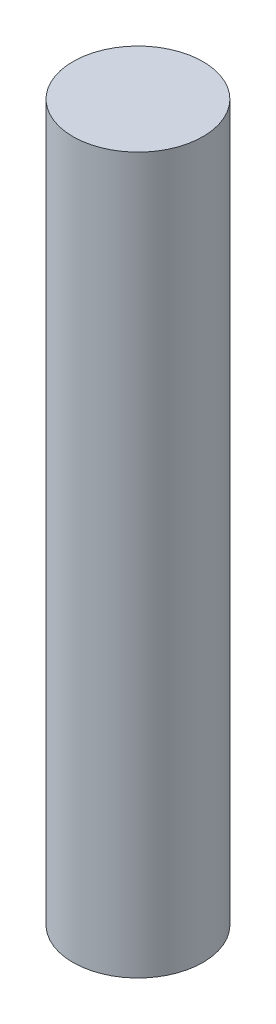
ISO-10303-21;
HEADER;
FILE_DESCRIPTION(('STEP AP214'),'2;1');
FILE_NAME('part.step','',(''),(''),'','','');
FILE_SCHEMA(('AUTOMOTIVE_DESIGN { 1 0 10303 214 1 1 1 1 }'));
ENDSEC;
DATA;
#1=APPLICATION_CONTEXT('core data for automotive mechanical design processes');
#2=APPLICATION_PROTOCOL_DEFINITION('international standard','automotive_design',2000,#1);
#3=PRODUCT_CONTEXT('',#1,'mechanical');
#4=PRODUCT('Part','Part','',(#3));
#5=PRODUCT_RELATED_PRODUCT_CATEGORY('part','',(#4));
#6=PRODUCT_DEFINITION_FORMATION('','',#4);
#7=PRODUCT_DEFINITION_CONTEXT('part definition',#1,'design');
#8=PRODUCT_DEFINITION('design','',#6,#7);
#9=PRODUCT_DEFINITION_SHAPE('','',#8);
#10=(LENGTH_UNIT() NAMED_UNIT(*) SI_UNIT(.MILLI.,.METRE.));
#11=(NAMED_UNIT(*) PLANE_ANGLE_UNIT() SI_UNIT($,.RADIAN.));
#12=(NAMED_UNIT(*) SI_UNIT($,.STERADIAN.) SOLID_ANGLE_UNIT());
#13=UNCERTAINTY_MEASURE_WITH_UNIT(LENGTH_MEASURE(1.E-05),#10,'distance_accuracy_value','');
#14=(GEOMETRIC_REPRESENTATION_CONTEXT(3) GLOBAL_UNCERTAINTY_ASSIGNED_CONTEXT((#13)) GLOBAL_UNIT_ASSIGNED_CONTEXT((#10,
#11,#12)) REPRESENTATION_CONTEXT('',''));
#15=CARTESIAN_POINT('',(0.,0.,0.));
#16=DIRECTION('',(0.,0.,1.));
#17=DIRECTION('',(1.,0.,0.));
#18=AXIS2_PLACEMENT_3D('',#15,#16,#17);
#19=CARTESIAN_POINT('',(0.,22.,0.));
#20=DIRECTION('',(0.,-1.,0.));
#21=DIRECTION('',(0.,0.,-1.));
#22=AXIS2_PLACEMENT_3D('',#19,#20,#21);
#23=CYLINDRICAL_SURFACE('',#22,2.);
#24=CARTESIAN_POINT('',(0.,22.,0.));
#25=DIRECTION('',(0.,1.,0.));
#26=DIRECTION('',(0.,0.,1.));
#27=AXIS2_PLACEMENT_3D('',#24,#25,#26);
#28=CIRCLE('',#27,2.);
#29=CARTESIAN_POINT('',(0.,22.,2.));
#30=VERTEX_POINT('',#29);
#31=EDGE_CURVE('E10',#30,#30,#28,.T.);
#32=ORIENTED_EDGE('',*,*,#31,.F.);
#33=EDGE_LOOP('',(#32));
#34=FACE_BOUND('',#33,.T.);
#35=CARTESIAN_POINT('',(0.,0.,0.));
#36=DIRECTION('',(0.,1.,0.));
#37=DIRECTION('',(0.,0.,1.));
#38=AXIS2_PLACEMENT_3D('',#35,#36,#37);
#39=CIRCLE('',#38,2.);
#40=CARTESIAN_POINT('',(0.,0.,2.));
#41=VERTEX_POINT('',#40);
#42=EDGE_CURVE('E36',#41,#41,#39,.T.);
#43=ORIENTED_EDGE('',*,*,#42,.T.);
#44=EDGE_LOOP('',(#43));
#45=FACE_BOUND('',#44,.T.);
#46=ADVANCED_FACE('F33',(#34,#45),#23,.T.);
#47=CARTESIAN_POINT('',(0.,22.,0.));
#48=DIRECTION('',(0.,1.,0.));
#49=DIRECTION('',(0.,0.,1.));
#50=AXIS2_PLACEMENT_3D('',#47,#48,#49);
#51=PLANE('',#50);
#52=ORIENTED_EDGE('',*,*,#31,.T.);
#53=EDGE_LOOP('',(#52));
#54=FACE_BOUND('',#53,.T.);
#55=ADVANCED_FACE('F48',(#54),#51,.T.);
#56=CARTESIAN_POINT('',(0.,0.,0.));
#57=DIRECTION('',(0.,1.,0.));
#58=DIRECTION('',(0.,0.,1.));
#59=AXIS2_PLACEMENT_3D('',#56,#57,#58);
#60=PLANE('',#59);
#61=ORIENTED_EDGE('',*,*,#42,.F.);
#62=EDGE_LOOP('',(#61));
#63=FACE_BOUND('',#62,.T.);
#64=ADVANCED_FACE('F46',(#63),#60,.F.);
#65=CLOSED_SHELL('',(#46,#55,#64));
#66=MANIFOLD_SOLID_BREP('B2',#65);
#67=ADVANCED_BREP_SHAPE_REPRESENTATION('',(#18,#66),#14);
#68=SHAPE_DEFINITION_REPRESENTATION(#9,#67);
ENDSEC;
END-ISO-10303-21;
